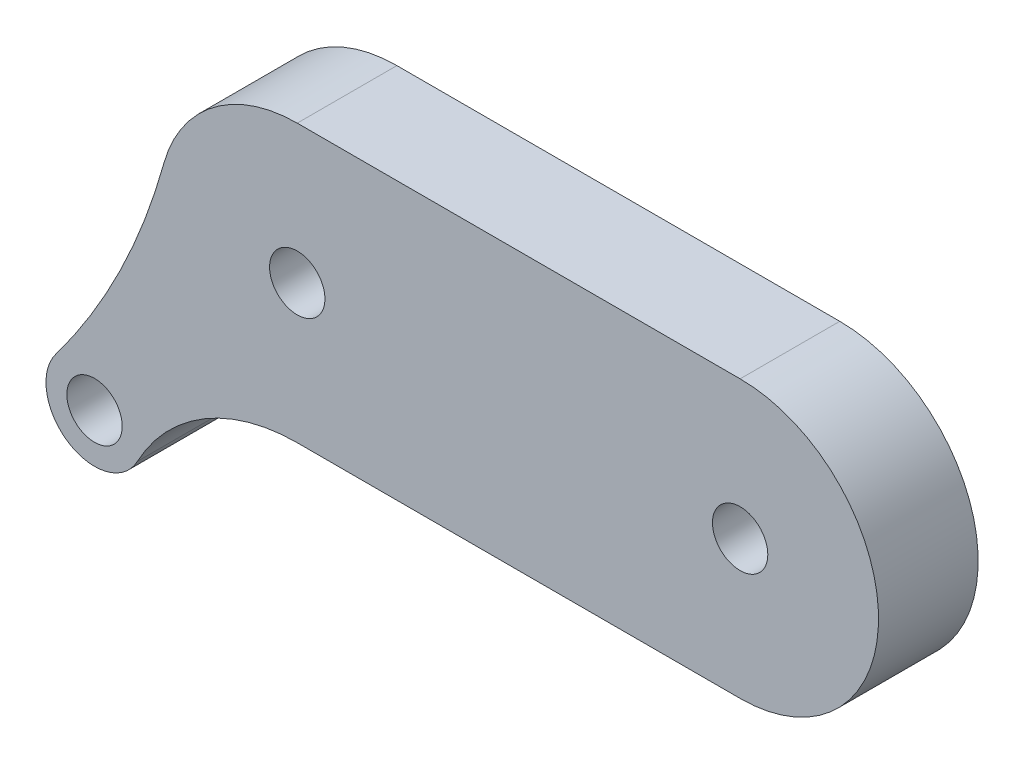
ISO-10303-21;
HEADER;
FILE_DESCRIPTION(('STEP AP214'),'2;1');
FILE_NAME('part.step','',(''),(''),'','','');
FILE_SCHEMA(('AUTOMOTIVE_DESIGN { 1 0 10303 214 1 1 1 1 }'));
ENDSEC;
DATA;
#1=APPLICATION_CONTEXT('core data for automotive mechanical design processes');
#2=APPLICATION_PROTOCOL_DEFINITION('international standard','automotive_design',2000,#1);
#3=PRODUCT_CONTEXT('',#1,'mechanical');
#4=PRODUCT('Part','Part','',(#3));
#5=PRODUCT_RELATED_PRODUCT_CATEGORY('part','',(#4));
#6=PRODUCT_DEFINITION_FORMATION('','',#4);
#7=PRODUCT_DEFINITION_CONTEXT('part definition',#1,'design');
#8=PRODUCT_DEFINITION('design','',#6,#7);
#9=PRODUCT_DEFINITION_SHAPE('','',#8);
#10=(LENGTH_UNIT() NAMED_UNIT(*) SI_UNIT(.MILLI.,.METRE.));
#11=(NAMED_UNIT(*) PLANE_ANGLE_UNIT() SI_UNIT($,.RADIAN.));
#12=(NAMED_UNIT(*) SI_UNIT($,.STERADIAN.) SOLID_ANGLE_UNIT());
#13=UNCERTAINTY_MEASURE_WITH_UNIT(LENGTH_MEASURE(1.E-05),#10,'distance_accuracy_value','');
#14=(GEOMETRIC_REPRESENTATION_CONTEXT(3) GLOBAL_UNCERTAINTY_ASSIGNED_CONTEXT((#13)) GLOBAL_UNIT_ASSIGNED_CONTEXT((#10,
#11,#12)) REPRESENTATION_CONTEXT('',''));
#15=CARTESIAN_POINT('',(0.,0.,0.));
#16=DIRECTION('',(0.,0.,1.));
#17=DIRECTION('',(1.,0.,0.));
#18=AXIS2_PLACEMENT_3D('',#15,#16,#17);
#19=CARTESIAN_POINT('',(0.,0.,3.6));
#20=DIRECTION('',(0.,0.,1.));
#21=DIRECTION('',(1.,0.,0.));
#22=AXIS2_PLACEMENT_3D('',#19,#20,#21);
#23=PLANE('',#22);
#24=CARTESIAN_POINT('',(0.,0.,3.6));
#25=DIRECTION('',(0.,0.,1.));
#26=DIRECTION('',(1.,0.,0.));
#27=AXIS2_PLACEMENT_3D('',#24,#25,#26);
#28=CIRCLE('',#27,1.);
#29=CARTESIAN_POINT('',(1.,0.,3.6));
#30=VERTEX_POINT('',#29);
#31=EDGE_CURVE('E163',#30,#30,#28,.T.);
#32=ORIENTED_EDGE('',*,*,#31,.F.);
#33=EDGE_LOOP('',(#32));
#34=FACE_BOUND('',#33,.T.);
#35=CARTESIAN_POINT('',(0.,0.,3.6));
#36=DIRECTION('',(0.,0.,1.));
#37=DIRECTION('',(1.,0.,0.));
#38=AXIS2_PLACEMENT_3D('',#35,#36,#37);
#39=CIRCLE('',#38,5.);
#40=CARTESIAN_POINT('',(0.,5.,3.6));
#41=VERTEX_POINT('',#40);
#42=CARTESIAN_POINT('',(-4.81838804523094,1.33534139663819,3.6));
#43=VERTEX_POINT('',#42);
#44=EDGE_CURVE('E136',#41,#43,#39,.T.);
#45=ORIENTED_EDGE('',*,*,#44,.T.);
#46=CARTESIAN_POINT('',(-27.6645387416887,7.66679716409328,3.6));
#47=DIRECTION('',(0.,0.,-1.));
#48=DIRECTION('',(-1.,0.,0.));
#49=AXIS2_PLACEMENT_3D('',#46,#47,#48);
#50=CIRCLE('',#49,23.7072548765245);
#51=CARTESIAN_POINT('',(-8.72507825142692,-6.59261271564265,3.6));
#52=VERTEX_POINT('',#51);
#53=EDGE_CURVE('E89',#43,#52,#50,.T.);
#54=ORIENTED_EDGE('',*,*,#53,.T.);
#55=CARTESIAN_POINT('',(-7.32386625858518,-7.64757709251101,3.6));
#56=DIRECTION('',(0.,0.,1.));
#57=DIRECTION('',(1.,0.,0.));
#58=AXIS2_PLACEMENT_3D('',#55,#56,#57);
#59=CIRCLE('',#58,1.75395122091373);
#60=CARTESIAN_POINT('',(-5.7750696823424,-8.4707259555749,3.6));
#61=VERTEX_POINT('',#60);
#62=EDGE_CURVE('E148',#52,#61,#59,.T.);
#63=ORIENTED_EDGE('',*,*,#62,.T.);
#64=CARTESIAN_POINT('',(0.,-11.5400393283272,3.6));
#65=DIRECTION('',(0.,0.,-1.));
#66=DIRECTION('',(-1.,0.,0.));
#67=AXIS2_PLACEMENT_3D('',#64,#65,#66);
#68=CIRCLE('',#67,6.54003932832719);
#69=CARTESIAN_POINT('',(0.,-5.,3.6));
#70=VERTEX_POINT('',#69);
#71=EDGE_CURVE('E105',#61,#70,#68,.T.);
#72=ORIENTED_EDGE('',*,*,#71,.T.);
#73=DIRECTION('',(1.,0.,0.));
#74=VECTOR('',#73,1.);
#75=CARTESIAN_POINT('',(0.,-5.,3.6));
#76=LINE('',#75,#74);
#77=CARTESIAN_POINT('',(16.,-5.,3.6));
#78=VERTEX_POINT('',#77);
#79=EDGE_CURVE('E99',#70,#78,#76,.T.);
#80=ORIENTED_EDGE('',*,*,#79,.T.);
#81=CARTESIAN_POINT('',(16.,0.,3.6));
#82=DIRECTION('',(0.,0.,1.));
#83=DIRECTION('',(1.,0.,0.));
#84=AXIS2_PLACEMENT_3D('',#81,#82,#83);
#85=CIRCLE('',#84,5.);
#86=CARTESIAN_POINT('',(16.,5.,3.6));
#87=VERTEX_POINT('',#86);
#88=EDGE_CURVE('E103',#78,#87,#85,.T.);
#89=ORIENTED_EDGE('',*,*,#88,.T.);
#90=DIRECTION('',(-1.,0.,0.));
#91=VECTOR('',#90,1.);
#92=CARTESIAN_POINT('',(0.,5.,3.6));
#93=LINE('',#92,#91);
#94=EDGE_CURVE('E49',#87,#41,#93,.T.);
#95=ORIENTED_EDGE('',*,*,#94,.T.);
#96=EDGE_LOOP('',(#45,#54,#63,#72,#80,#89,#95));
#97=FACE_BOUND('',#96,.T.);
#98=CARTESIAN_POINT('',(-7.32386625858518,-7.64757709251101,3.6));
#99=DIRECTION('',(0.,0.,1.));
#100=DIRECTION('',(1.,0.,0.));
#101=AXIS2_PLACEMENT_3D('',#98,#99,#100);
#102=CIRCLE('',#101,1.);
#103=CARTESIAN_POINT('',(-6.32386625858518,-7.64757709251101,3.6));
#104=VERTEX_POINT('',#103);
#105=EDGE_CURVE('E127',#104,#104,#102,.T.);
#106=ORIENTED_EDGE('',*,*,#105,.F.);
#107=EDGE_LOOP('',(#106));
#108=FACE_BOUND('',#107,.T.);
#109=CARTESIAN_POINT('',(16.,0.,3.6));
#110=DIRECTION('',(0.,0.,1.));
#111=DIRECTION('',(1.,0.,0.));
#112=AXIS2_PLACEMENT_3D('',#109,#110,#111);
#113=CIRCLE('',#112,1.);
#114=CARTESIAN_POINT('',(17.,0.,3.6));
#115=VERTEX_POINT('',#114);
#116=EDGE_CURVE('E169',#115,#115,#113,.T.);
#117=ORIENTED_EDGE('',*,*,#116,.F.);
#118=EDGE_LOOP('',(#117));
#119=FACE_BOUND('',#118,.T.);
#120=ADVANCED_FACE('F32',(#34,#97,#108,#119),#23,.T.);
#121=CARTESIAN_POINT('',(0.,0.,0.));
#122=DIRECTION('',(0.,0.,1.));
#123=DIRECTION('',(1.,0.,0.));
#124=AXIS2_PLACEMENT_3D('',#121,#122,#123);
#125=PLANE('',#124);
#126=CARTESIAN_POINT('',(0.,0.,0.));
#127=DIRECTION('',(0.,0.,1.));
#128=DIRECTION('',(1.,0.,0.));
#129=AXIS2_PLACEMENT_3D('',#126,#127,#128);
#130=CIRCLE('',#129,5.);
#131=CARTESIAN_POINT('',(0.,5.,0.));
#132=VERTEX_POINT('',#131);
#133=CARTESIAN_POINT('',(-4.81838804523094,1.33534139663819,0.));
#134=VERTEX_POINT('',#133);
#135=EDGE_CURVE('E123',#132,#134,#130,.T.);
#136=ORIENTED_EDGE('',*,*,#135,.F.);
#137=DIRECTION('',(-1.,0.,0.));
#138=VECTOR('',#137,1.);
#139=CARTESIAN_POINT('',(0.,5.,0.));
#140=LINE('',#139,#138);
#141=CARTESIAN_POINT('',(16.,5.,0.));
#142=VERTEX_POINT('',#141);
#143=EDGE_CURVE('E81',#142,#132,#140,.T.);
#144=ORIENTED_EDGE('',*,*,#143,.F.);
#145=CARTESIAN_POINT('',(16.,0.,0.));
#146=DIRECTION('',(0.,0.,1.));
#147=DIRECTION('',(1.,0.,0.));
#148=AXIS2_PLACEMENT_3D('',#145,#146,#147);
#149=CIRCLE('',#148,5.);
#150=CARTESIAN_POINT('',(16.,-5.,0.));
#151=VERTEX_POINT('',#150);
#152=EDGE_CURVE('E75',#151,#142,#149,.T.);
#153=ORIENTED_EDGE('',*,*,#152,.F.);
#154=DIRECTION('',(1.,0.,0.));
#155=VECTOR('',#154,1.);
#156=CARTESIAN_POINT('',(0.,-5.,0.));
#157=LINE('',#156,#155);
#158=CARTESIAN_POINT('',(0.,-5.,0.));
#159=VERTEX_POINT('',#158);
#160=EDGE_CURVE('E113',#159,#151,#157,.T.);
#161=ORIENTED_EDGE('',*,*,#160,.F.);
#162=CARTESIAN_POINT('',(0.,-11.5400393283272,0.));
#163=DIRECTION('',(0.,0.,-1.));
#164=DIRECTION('',(-1.,0.,0.));
#165=AXIS2_PLACEMENT_3D('',#162,#163,#164);
#166=CIRCLE('',#165,6.54003932832719);
#167=CARTESIAN_POINT('',(-5.7750696823424,-8.4707259555749,0.));
#168=VERTEX_POINT('',#167);
#169=EDGE_CURVE('E131',#168,#159,#166,.T.);
#170=ORIENTED_EDGE('',*,*,#169,.F.);
#171=CARTESIAN_POINT('',(-7.32386625858518,-7.64757709251101,0.));
#172=DIRECTION('',(0.,0.,1.));
#173=DIRECTION('',(1.,0.,0.));
#174=AXIS2_PLACEMENT_3D('',#171,#172,#173);
#175=CIRCLE('',#174,1.75395122091373);
#176=CARTESIAN_POINT('',(-8.72507825142692,-6.59261271564265,0.));
#177=VERTEX_POINT('',#176);
#178=EDGE_CURVE('E129',#177,#168,#175,.T.);
#179=ORIENTED_EDGE('',*,*,#178,.F.);
#180=CARTESIAN_POINT('',(-27.6645387416887,7.66679716409328,0.));
#181=DIRECTION('',(0.,0.,-1.));
#182=DIRECTION('',(-1.,0.,0.));
#183=AXIS2_PLACEMENT_3D('',#180,#181,#182);
#184=CIRCLE('',#183,23.7072548765245);
#185=EDGE_CURVE('E126',#134,#177,#184,.T.);
#186=ORIENTED_EDGE('',*,*,#185,.F.);
#187=EDGE_LOOP('',(#136,#144,#153,#161,#170,#179,#186));
#188=FACE_BOUND('',#187,.T.);
#189=CARTESIAN_POINT('',(-7.32386625858518,-7.64757709251101,0.));
#190=DIRECTION('',(0.,0.,1.));
#191=DIRECTION('',(1.,0.,0.));
#192=AXIS2_PLACEMENT_3D('',#189,#190,#191);
#193=CIRCLE('',#192,1.);
#194=CARTESIAN_POINT('',(-6.32386625858518,-7.64757709251101,0.));
#195=VERTEX_POINT('',#194);
#196=EDGE_CURVE('E160',#195,#195,#193,.T.);
#197=ORIENTED_EDGE('',*,*,#196,.T.);
#198=EDGE_LOOP('',(#197));
#199=FACE_BOUND('',#198,.T.);
#200=CARTESIAN_POINT('',(0.,0.,0.));
#201=DIRECTION('',(0.,0.,1.));
#202=DIRECTION('',(1.,0.,0.));
#203=AXIS2_PLACEMENT_3D('',#200,#201,#202);
#204=CIRCLE('',#203,1.);
#205=CARTESIAN_POINT('',(1.,0.,0.));
#206=VERTEX_POINT('',#205);
#207=EDGE_CURVE('E166',#206,#206,#204,.T.);
#208=ORIENTED_EDGE('',*,*,#207,.T.);
#209=EDGE_LOOP('',(#208));
#210=FACE_BOUND('',#209,.T.);
#211=CARTESIAN_POINT('',(16.,0.,0.));
#212=DIRECTION('',(0.,0.,1.));
#213=DIRECTION('',(1.,0.,0.));
#214=AXIS2_PLACEMENT_3D('',#211,#212,#213);
#215=CIRCLE('',#214,1.);
#216=CARTESIAN_POINT('',(17.,0.,0.));
#217=VERTEX_POINT('',#216);
#218=EDGE_CURVE('E172',#217,#217,#215,.T.);
#219=ORIENTED_EDGE('',*,*,#218,.T.);
#220=EDGE_LOOP('',(#219));
#221=FACE_BOUND('',#220,.T.);
#222=ADVANCED_FACE('F152',(#188,#199,#210,#221),#125,.F.);
#223=CARTESIAN_POINT('',(0.,0.,3.6));
#224=DIRECTION('',(0.,0.,-1.));
#225=DIRECTION('',(-1.,0.,0.));
#226=AXIS2_PLACEMENT_3D('',#223,#224,#225);
#227=CYLINDRICAL_SURFACE('',#226,5.);
#228=ORIENTED_EDGE('',*,*,#135,.T.);
#229=DIRECTION('',(0.,0.,-1.));
#230=VECTOR('',#229,1.);
#231=CARTESIAN_POINT('',(-4.81838804523094,1.33534139663819,3.6));
#232=LINE('',#231,#230);
#233=EDGE_CURVE('E11',#43,#134,#232,.T.);
#234=ORIENTED_EDGE('',*,*,#233,.F.);
#235=ORIENTED_EDGE('',*,*,#44,.F.);
#236=DIRECTION('',(0.,0.,-1.));
#237=VECTOR('',#236,1.);
#238=CARTESIAN_POINT('',(0.,5.,3.6));
#239=LINE('',#238,#237);
#240=EDGE_CURVE('E119',#41,#132,#239,.T.);
#241=ORIENTED_EDGE('',*,*,#240,.T.);
#242=EDGE_LOOP('',(#228,#234,#235,#241));
#243=FACE_BOUND('',#242,.T.);
#244=ADVANCED_FACE('F34',(#243),#227,.T.);
#245=CARTESIAN_POINT('',(-27.6645387416887,7.66679716409328,3.6));
#246=DIRECTION('',(0.,0.,-1.));
#247=DIRECTION('',(-1.,0.,0.));
#248=AXIS2_PLACEMENT_3D('',#245,#246,#247);
#249=CYLINDRICAL_SURFACE('',#248,23.7072548765245);
#250=ORIENTED_EDGE('',*,*,#185,.T.);
#251=DIRECTION('',(0.,0.,-1.));
#252=VECTOR('',#251,1.);
#253=CARTESIAN_POINT('',(-8.72507825142692,-6.59261271564265,3.6));
#254=LINE('',#253,#252);
#255=EDGE_CURVE('E41',#52,#177,#254,.T.);
#256=ORIENTED_EDGE('',*,*,#255,.F.);
#257=ORIENTED_EDGE('',*,*,#53,.F.);
#258=ORIENTED_EDGE('',*,*,#233,.T.);
#259=EDGE_LOOP('',(#250,#256,#257,#258));
#260=FACE_BOUND('',#259,.T.);
#261=ADVANCED_FACE('F203',(#260),#249,.F.);
#262=CARTESIAN_POINT('',(-7.32386625858518,-7.64757709251101,3.6));
#263=DIRECTION('',(0.,0.,-1.));
#264=DIRECTION('',(-1.,0.,0.));
#265=AXIS2_PLACEMENT_3D('',#262,#263,#264);
#266=CYLINDRICAL_SURFACE('',#265,1.75395122091373);
#267=ORIENTED_EDGE('',*,*,#178,.T.);
#268=DIRECTION('',(0.,0.,-1.));
#269=VECTOR('',#268,1.);
#270=CARTESIAN_POINT('',(-5.7750696823424,-8.4707259555749,3.6));
#271=LINE('',#270,#269);
#272=EDGE_CURVE('E140',#61,#168,#271,.T.);
#273=ORIENTED_EDGE('',*,*,#272,.F.);
#274=ORIENTED_EDGE('',*,*,#62,.F.);
#275=ORIENTED_EDGE('',*,*,#255,.T.);
#276=EDGE_LOOP('',(#267,#273,#274,#275));
#277=FACE_BOUND('',#276,.T.);
#278=ADVANCED_FACE('F146',(#277),#266,.T.);
#279=CARTESIAN_POINT('',(0.,-11.5400393283272,3.6));
#280=DIRECTION('',(0.,0.,-1.));
#281=DIRECTION('',(-1.,0.,0.));
#282=AXIS2_PLACEMENT_3D('',#279,#280,#281);
#283=CYLINDRICAL_SURFACE('',#282,6.54003932832719);
#284=ORIENTED_EDGE('',*,*,#169,.T.);
#285=DIRECTION('',(0.,0.,-1.));
#286=VECTOR('',#285,1.);
#287=CARTESIAN_POINT('',(0.,-5.,3.6));
#288=LINE('',#287,#286);
#289=EDGE_CURVE('E114',#70,#159,#288,.T.);
#290=ORIENTED_EDGE('',*,*,#289,.F.);
#291=ORIENTED_EDGE('',*,*,#71,.F.);
#292=ORIENTED_EDGE('',*,*,#272,.T.);
#293=EDGE_LOOP('',(#284,#290,#291,#292));
#294=FACE_BOUND('',#293,.T.);
#295=ADVANCED_FACE('F155',(#294),#283,.F.);
#296=CARTESIAN_POINT('',(0.,-5.,3.6));
#297=DIRECTION('',(0.,1.,0.));
#298=DIRECTION('',(-1.,0.,0.));
#299=AXIS2_PLACEMENT_3D('',#296,#297,#298);
#300=PLANE('',#299);
#301=ORIENTED_EDGE('',*,*,#160,.T.);
#302=DIRECTION('',(0.,0.,-1.));
#303=VECTOR('',#302,1.);
#304=CARTESIAN_POINT('',(16.,-5.,3.6));
#305=LINE('',#304,#303);
#306=EDGE_CURVE('E110',#78,#151,#305,.T.);
#307=ORIENTED_EDGE('',*,*,#306,.F.);
#308=ORIENTED_EDGE('',*,*,#79,.F.);
#309=ORIENTED_EDGE('',*,*,#289,.T.);
#310=EDGE_LOOP('',(#301,#307,#308,#309));
#311=FACE_BOUND('',#310,.T.);
#312=ADVANCED_FACE('F111',(#311),#300,.F.);
#313=CARTESIAN_POINT('',(16.,0.,3.6));
#314=DIRECTION('',(0.,0.,-1.));
#315=DIRECTION('',(-1.,0.,0.));
#316=AXIS2_PLACEMENT_3D('',#313,#314,#315);
#317=CYLINDRICAL_SURFACE('',#316,5.);
#318=ORIENTED_EDGE('',*,*,#152,.T.);
#319=DIRECTION('',(0.,0.,-1.));
#320=VECTOR('',#319,1.);
#321=CARTESIAN_POINT('',(16.,5.,3.6));
#322=LINE('',#321,#320);
#323=EDGE_CURVE('E115',#87,#142,#322,.T.);
#324=ORIENTED_EDGE('',*,*,#323,.F.);
#325=ORIENTED_EDGE('',*,*,#88,.F.);
#326=ORIENTED_EDGE('',*,*,#306,.T.);
#327=EDGE_LOOP('',(#318,#324,#325,#326));
#328=FACE_BOUND('',#327,.T.);
#329=ADVANCED_FACE('F117',(#328),#317,.T.);
#330=CARTESIAN_POINT('',(0.,5.,3.6));
#331=DIRECTION('',(0.,-1.,0.));
#332=DIRECTION('',(0.,0.,-1.));
#333=AXIS2_PLACEMENT_3D('',#330,#331,#332);
#334=PLANE('',#333);
#335=ORIENTED_EDGE('',*,*,#143,.T.);
#336=ORIENTED_EDGE('',*,*,#240,.F.);
#337=ORIENTED_EDGE('',*,*,#94,.F.);
#338=ORIENTED_EDGE('',*,*,#323,.T.);
#339=EDGE_LOOP('',(#335,#336,#337,#338));
#340=FACE_BOUND('',#339,.T.);
#341=ADVANCED_FACE('F193',(#340),#334,.F.);
#342=CARTESIAN_POINT('',(-7.32386625858518,-7.64757709251101,3.6));
#343=DIRECTION('',(0.,0.,-1.));
#344=DIRECTION('',(-1.,0.,0.));
#345=AXIS2_PLACEMENT_3D('',#342,#343,#344);
#346=CYLINDRICAL_SURFACE('',#345,1.);
#347=ORIENTED_EDGE('',*,*,#105,.T.);
#348=EDGE_LOOP('',(#347));
#349=FACE_BOUND('',#348,.T.);
#350=ORIENTED_EDGE('',*,*,#196,.F.);
#351=EDGE_LOOP('',(#350));
#352=FACE_BOUND('',#351,.T.);
#353=ADVANCED_FACE('F190',(#349,#352),#346,.F.);
#354=CARTESIAN_POINT('',(0.,0.,3.6));
#355=DIRECTION('',(0.,0.,-1.));
#356=DIRECTION('',(-1.,0.,0.));
#357=AXIS2_PLACEMENT_3D('',#354,#355,#356);
#358=CYLINDRICAL_SURFACE('',#357,1.);
#359=ORIENTED_EDGE('',*,*,#31,.T.);
#360=EDGE_LOOP('',(#359));
#361=FACE_BOUND('',#360,.T.);
#362=ORIENTED_EDGE('',*,*,#207,.F.);
#363=EDGE_LOOP('',(#362));
#364=FACE_BOUND('',#363,.T.);
#365=ADVANCED_FACE('F262',(#361,#364),#358,.F.);
#366=CARTESIAN_POINT('',(16.,0.,3.6));
#367=DIRECTION('',(0.,0.,-1.));
#368=DIRECTION('',(-1.,0.,0.));
#369=AXIS2_PLACEMENT_3D('',#366,#367,#368);
#370=CYLINDRICAL_SURFACE('',#369,1.);
#371=ORIENTED_EDGE('',*,*,#116,.T.);
#372=EDGE_LOOP('',(#371));
#373=FACE_BOUND('',#372,.T.);
#374=ORIENTED_EDGE('',*,*,#218,.F.);
#375=EDGE_LOOP('',(#374));
#376=FACE_BOUND('',#375,.T.);
#377=ADVANCED_FACE('F178',(#373,#376),#370,.F.);
#378=CLOSED_SHELL('',(#120,#222,#244,#261,#278,#295,#312,#329,#341,#353,#365,#377));
#379=MANIFOLD_SOLID_BREP('B2',#378);
#380=ADVANCED_BREP_SHAPE_REPRESENTATION('',(#18,#379),#14);
#381=SHAPE_DEFINITION_REPRESENTATION(#9,#380);
ENDSEC;
END-ISO-10303-21;
